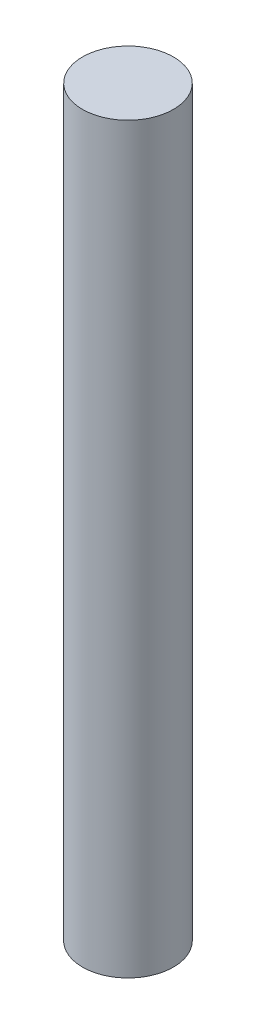
ISO-10303-21;
HEADER;
FILE_DESCRIPTION(('STEP AP214'),'2;1');
FILE_NAME('part.step','',(''),(''),'','','');
FILE_SCHEMA(('AUTOMOTIVE_DESIGN { 1 0 10303 214 1 1 1 1 }'));
ENDSEC;
DATA;
#1=APPLICATION_CONTEXT('core data for automotive mechanical design processes');
#2=APPLICATION_PROTOCOL_DEFINITION('international standard','automotive_design',2000,#1);
#3=PRODUCT_CONTEXT('',#1,'mechanical');
#4=PRODUCT('Part','Part','',(#3));
#5=PRODUCT_RELATED_PRODUCT_CATEGORY('part','',(#4));
#6=PRODUCT_DEFINITION_FORMATION('','',#4);
#7=PRODUCT_DEFINITION_CONTEXT('part definition',#1,'design');
#8=PRODUCT_DEFINITION('design','',#6,#7);
#9=PRODUCT_DEFINITION_SHAPE('','',#8);
#10=(LENGTH_UNIT() NAMED_UNIT(*) SI_UNIT(.MILLI.,.METRE.));
#11=(NAMED_UNIT(*) PLANE_ANGLE_UNIT() SI_UNIT($,.RADIAN.));
#12=(NAMED_UNIT(*) SI_UNIT($,.STERADIAN.) SOLID_ANGLE_UNIT());
#13=UNCERTAINTY_MEASURE_WITH_UNIT(LENGTH_MEASURE(1.E-05),#10,'distance_accuracy_value','');
#14=(GEOMETRIC_REPRESENTATION_CONTEXT(3) GLOBAL_UNCERTAINTY_ASSIGNED_CONTEXT((#13)) GLOBAL_UNIT_ASSIGNED_CONTEXT((#10,
#11,#12)) REPRESENTATION_CONTEXT('',''));
#15=CARTESIAN_POINT('',(0.,0.,0.));
#16=DIRECTION('',(0.,0.,1.));
#17=DIRECTION('',(1.,0.,0.));
#18=AXIS2_PLACEMENT_3D('',#15,#16,#17);
#19=CARTESIAN_POINT('',(0.,9.8,0.));
#20=DIRECTION('',(0.,-1.,0.));
#21=DIRECTION('',(0.,0.,-1.));
#22=AXIS2_PLACEMENT_3D('',#19,#20,#21);
#23=CYLINDRICAL_SURFACE('',#22,0.6);
#24=CARTESIAN_POINT('',(0.,9.8,0.));
#25=DIRECTION('',(0.,1.,0.));
#26=DIRECTION('',(0.,0.,1.));
#27=AXIS2_PLACEMENT_3D('',#24,#25,#26);
#28=CIRCLE('',#27,0.6);
#29=CARTESIAN_POINT('',(0.,9.8,0.6));
#30=VERTEX_POINT('',#29);
#31=EDGE_CURVE('E10',#30,#30,#28,.T.);
#32=ORIENTED_EDGE('',*,*,#31,.F.);
#33=EDGE_LOOP('',(#32));
#34=FACE_BOUND('',#33,.T.);
#35=CARTESIAN_POINT('',(0.,0.,0.));
#36=DIRECTION('',(0.,1.,0.));
#37=DIRECTION('',(0.,0.,1.));
#38=AXIS2_PLACEMENT_3D('',#35,#36,#37);
#39=CIRCLE('',#38,0.6);
#40=CARTESIAN_POINT('',(0.,0.,0.6));
#41=VERTEX_POINT('',#40);
#42=EDGE_CURVE('E36',#41,#41,#39,.T.);
#43=ORIENTED_EDGE('',*,*,#42,.T.);
#44=EDGE_LOOP('',(#43));
#45=FACE_BOUND('',#44,.T.);
#46=ADVANCED_FACE('F33',(#34,#45),#23,.T.);
#47=CARTESIAN_POINT('',(0.,9.8,0.));
#48=DIRECTION('',(0.,1.,0.));
#49=DIRECTION('',(0.,0.,1.));
#50=AXIS2_PLACEMENT_3D('',#47,#48,#49);
#51=PLANE('',#50);
#52=ORIENTED_EDGE('',*,*,#31,.T.);
#53=EDGE_LOOP('',(#52));
#54=FACE_BOUND('',#53,.T.);
#55=ADVANCED_FACE('F48',(#54),#51,.T.);
#56=CARTESIAN_POINT('',(0.,0.,0.));
#57=DIRECTION('',(0.,1.,0.));
#58=DIRECTION('',(0.,0.,1.));
#59=AXIS2_PLACEMENT_3D('',#56,#57,#58);
#60=PLANE('',#59);
#61=ORIENTED_EDGE('',*,*,#42,.F.);
#62=EDGE_LOOP('',(#61));
#63=FACE_BOUND('',#62,.T.);
#64=ADVANCED_FACE('F46',(#63),#60,.F.);
#65=CLOSED_SHELL('',(#46,#55,#64));
#66=MANIFOLD_SOLID_BREP('B2',#65);
#67=ADVANCED_BREP_SHAPE_REPRESENTATION('',(#18,#66),#14);
#68=SHAPE_DEFINITION_REPRESENTATION(#9,#67);
ENDSEC;
END-ISO-10303-21;
